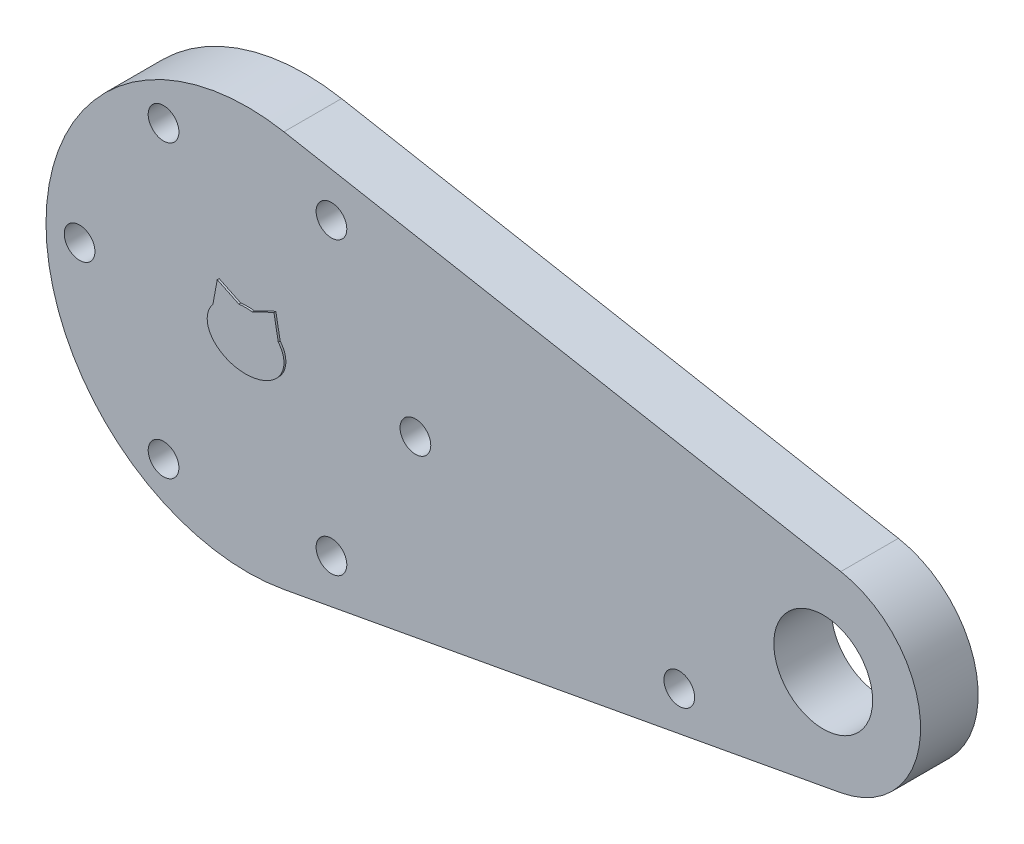
ISO-10303-21;
HEADER;
FILE_DESCRIPTION(('STEP AP214'),'2;1');
FILE_NAME('part.step','',(''),(''),'','','');
FILE_SCHEMA(('AUTOMOTIVE_DESIGN { 1 0 10303 214 1 1 1 1 }'));
ENDSEC;
DATA;
#1=APPLICATION_CONTEXT('core data for automotive mechanical design processes');
#2=APPLICATION_PROTOCOL_DEFINITION('international standard','automotive_design',2000,#1);
#3=PRODUCT_CONTEXT('',#1,'mechanical');
#4=PRODUCT('Part','Part','',(#3));
#5=PRODUCT_RELATED_PRODUCT_CATEGORY('part','',(#4));
#6=PRODUCT_DEFINITION_FORMATION('','',#4);
#7=PRODUCT_DEFINITION_CONTEXT('part definition',#1,'design');
#8=PRODUCT_DEFINITION('design','',#6,#7);
#9=PRODUCT_DEFINITION_SHAPE('','',#8);
#10=(LENGTH_UNIT() NAMED_UNIT(*) SI_UNIT(.MILLI.,.METRE.));
#11=(NAMED_UNIT(*) PLANE_ANGLE_UNIT() SI_UNIT($,.RADIAN.));
#12=(NAMED_UNIT(*) SI_UNIT($,.STERADIAN.) SOLID_ANGLE_UNIT());
#13=UNCERTAINTY_MEASURE_WITH_UNIT(LENGTH_MEASURE(1.E-05),#10,'distance_accuracy_value','');
#14=(GEOMETRIC_REPRESENTATION_CONTEXT(3) GLOBAL_UNCERTAINTY_ASSIGNED_CONTEXT((#13)) GLOBAL_UNIT_ASSIGNED_CONTEXT((#10,
#11,#12)) REPRESENTATION_CONTEXT('',''));
#15=CARTESIAN_POINT('',(0.,0.,0.));
#16=DIRECTION('',(0.,0.,1.));
#17=DIRECTION('',(1.,0.,0.));
#18=AXIS2_PLACEMENT_3D('',#15,#16,#17);
#19=CARTESIAN_POINT('',(60.,0.,6.));
#20=DIRECTION('',(0.,0.,1.));
#21=DIRECTION('',(1.,0.,0.));
#22=AXIS2_PLACEMENT_3D('',#19,#20,#21);
#23=PLANE('',#22);
#24=CARTESIAN_POINT('',(45.,-9.,6.));
#25=DIRECTION('',(0.,0.,1.));
#26=DIRECTION('',(1.,0.,0.));
#27=AXIS2_PLACEMENT_3D('',#24,#25,#26);
#28=CIRCLE('',#27,1.6);
#29=CARTESIAN_POINT('',(43.4,-9.,6.));
#30=VERTEX_POINT('',#29);
#31=EDGE_CURVE('E340',#30,#30,#28,.T.);
#32=ORIENTED_EDGE('',*,*,#31,.F.);
#33=EDGE_LOOP('',(#32));
#34=FACE_BOUND('',#33,.T.);
#35=CARTESIAN_POINT('',(-8.75000000000004,15.1554445662277,6.));
#36=DIRECTION('',(0.,0.,1.));
#37=DIRECTION('',(1.,0.,0.));
#38=AXIS2_PLACEMENT_3D('',#35,#36,#37);
#39=CIRCLE('',#38,1.6);
#40=CARTESIAN_POINT('',(-7.15000000000004,15.1554445662277,6.));
#41=VERTEX_POINT('',#40);
#42=EDGE_CURVE('E213',#41,#41,#39,.T.);
#43=ORIENTED_EDGE('',*,*,#42,.F.);
#44=EDGE_LOOP('',(#43));
#45=FACE_BOUND('',#44,.T.);
#46=CARTESIAN_POINT('',(-17.5,0.,6.));
#47=DIRECTION('',(0.,0.,1.));
#48=DIRECTION('',(1.,0.,0.));
#49=AXIS2_PLACEMENT_3D('',#46,#47,#48);
#50=CIRCLE('',#49,1.6);
#51=CARTESIAN_POINT('',(-15.9,0.,6.));
#52=VERTEX_POINT('',#51);
#53=EDGE_CURVE('E224',#52,#52,#50,.T.);
#54=ORIENTED_EDGE('',*,*,#53,.F.);
#55=EDGE_LOOP('',(#54));
#56=FACE_BOUND('',#55,.T.);
#57=CARTESIAN_POINT('',(-8.74999999999996,-15.1554445662277,6.));
#58=DIRECTION('',(0.,0.,1.));
#59=DIRECTION('',(1.,0.,0.));
#60=AXIS2_PLACEMENT_3D('',#57,#58,#59);
#61=CIRCLE('',#60,1.6);
#62=CARTESIAN_POINT('',(-7.14999999999996,-15.1554445662277,6.));
#63=VERTEX_POINT('',#62);
#64=EDGE_CURVE('E221',#63,#63,#61,.T.);
#65=ORIENTED_EDGE('',*,*,#64,.F.);
#66=EDGE_LOOP('',(#65));
#67=FACE_BOUND('',#66,.T.);
#68=CARTESIAN_POINT('',(8.75000000000004,-15.1554445662277,6.));
#69=DIRECTION('',(0.,0.,1.));
#70=DIRECTION('',(1.,0.,0.));
#71=AXIS2_PLACEMENT_3D('',#68,#69,#70);
#72=CIRCLE('',#71,1.6);
#73=CARTESIAN_POINT('',(10.35,-15.1554445662277,6.));
#74=VERTEX_POINT('',#73);
#75=EDGE_CURVE('E218',#74,#74,#72,.T.);
#76=ORIENTED_EDGE('',*,*,#75,.F.);
#77=EDGE_LOOP('',(#76));
#78=FACE_BOUND('',#77,.T.);
#79=CARTESIAN_POINT('',(17.5,0.,6.));
#80=DIRECTION('',(0.,0.,1.));
#81=DIRECTION('',(1.,0.,0.));
#82=AXIS2_PLACEMENT_3D('',#79,#80,#81);
#83=CIRCLE('',#82,1.6);
#84=CARTESIAN_POINT('',(19.1,0.,6.));
#85=VERTEX_POINT('',#84);
#86=EDGE_CURVE('E214',#85,#85,#83,.T.);
#87=ORIENTED_EDGE('',*,*,#86,.F.);
#88=EDGE_LOOP('',(#87));
#89=FACE_BOUND('',#88,.T.);
#90=CARTESIAN_POINT('',(8.74999999999996,15.1554445662277,6.));
#91=DIRECTION('',(0.,0.,1.));
#92=DIRECTION('',(1.,0.,0.));
#93=AXIS2_PLACEMENT_3D('',#90,#91,#92);
#94=CIRCLE('',#93,1.6);
#95=CARTESIAN_POINT('',(10.35,15.1554445662277,6.));
#96=VERTEX_POINT('',#95);
#97=EDGE_CURVE('E217',#96,#96,#94,.T.);
#98=ORIENTED_EDGE('',*,*,#97,.F.);
#99=EDGE_LOOP('',(#98));
#100=FACE_BOUND('',#99,.T.);
#101=CARTESIAN_POINT('',(60.,0.,6.));
#102=DIRECTION('',(0.,0.,1.));
#103=DIRECTION('',(1.,0.,0.));
#104=AXIS2_PLACEMENT_3D('',#101,#102,#103);
#105=CIRCLE('',#104,10.15);
#106=CARTESIAN_POINT('',(61.8354583333333,-9.98266460954174,6.));
#107=VERTEX_POINT('',#106);
#108=CARTESIAN_POINT('',(61.8354583333333,9.98266460954174,6.));
#109=VERTEX_POINT('',#108);
#110=EDGE_CURVE('E238',#107,#109,#105,.T.);
#111=ORIENTED_EDGE('',*,*,#110,.T.);
#112=DIRECTION('',(-0.983513754634655,0.180833333333333,0.));
#113=VECTOR('',#112,1.);
#114=CARTESIAN_POINT('',(3.7975,20.6537888473278,6.));
#115=LINE('',#114,#113);
#116=CARTESIAN_POINT('',(3.7975,20.6537888473278,6.));
#117=VERTEX_POINT('',#116);
#118=EDGE_CURVE('E94',#109,#117,#115,.T.);
#119=ORIENTED_EDGE('',*,*,#118,.T.);
#120=CARTESIAN_POINT('',(0.,0.,6.));
#121=DIRECTION('',(0.,0.,1.));
#122=DIRECTION('',(1.,0.,0.));
#123=AXIS2_PLACEMENT_3D('',#120,#121,#122);
#124=CIRCLE('',#123,21.);
#125=CARTESIAN_POINT('',(3.7975,-20.6537888473277,6.));
#126=VERTEX_POINT('',#125);
#127=EDGE_CURVE('E241',#117,#126,#124,.T.);
#128=ORIENTED_EDGE('',*,*,#127,.T.);
#129=DIRECTION('',(0.983513754634655,0.180833333333333,0.));
#130=VECTOR('',#129,1.);
#131=CARTESIAN_POINT('',(61.8354583333333,-9.98266460954174,6.));
#132=LINE('',#131,#130);
#133=EDGE_CURVE('E65',#126,#107,#132,.T.);
#134=ORIENTED_EDGE('',*,*,#133,.T.);
#135=EDGE_LOOP('',(#111,#119,#128,#134));
#136=FACE_BOUND('',#135,.T.);
#137=CARTESIAN_POINT('',(60.,0.,6.));
#138=DIRECTION('',(0.,0.,1.));
#139=DIRECTION('',(1.,0.,0.));
#140=AXIS2_PLACEMENT_3D('',#137,#138,#139);
#141=CIRCLE('',#140,5.15);
#142=CARTESIAN_POINT('',(65.15,0.,6.));
#143=VERTEX_POINT('',#142);
#144=EDGE_CURVE('E232',#143,#143,#141,.T.);
#145=ORIENTED_EDGE('',*,*,#144,.F.);
#146=EDGE_LOOP('',(#145));
#147=FACE_BOUND('',#146,.T.);
#148=DIRECTION('',(-0.180057538320754,0.983656079579581,0.));
#149=VECTOR('',#148,1.);
#150=CARTESIAN_POINT('',(2.95476962414588,4.03352655479356,6.));
#151=LINE('',#150,#149);
#152=CARTESIAN_POINT('',(3.40491346994776,1.57438635584461,6.));
#153=VERTEX_POINT('',#152);
#154=CARTESIAN_POINT('',(2.95476962414588,4.03352655479356,6.));
#155=VERTEX_POINT('',#154);
#156=EDGE_CURVE('E333',#153,#155,#151,.T.);
#157=ORIENTED_EDGE('',*,*,#156,.F.);
#158=CARTESIAN_POINT('',(0.,0.,6.));
#159=DIRECTION('',(0.,0.,1.));
#160=DIRECTION('',(1.,0.,0.));
#161=AXIS2_PLACEMENT_3D('',#158,#159,#160);
#162=ELLIPSE('',#161,4.,3.);
#163=CARTESIAN_POINT('',(-3.40491346994776,1.57438635584461,6.));
#164=VERTEX_POINT('',#163);
#165=EDGE_CURVE('E151',#164,#153,#162,.T.);
#166=ORIENTED_EDGE('',*,*,#165,.F.);
#167=DIRECTION('',(-0.180057538320754,-0.983656079579581,0.));
#168=VECTOR('',#167,1.);
#169=CARTESIAN_POINT('',(-2.95476962414588,4.03352655479356,6.));
#170=LINE('',#169,#168);
#171=CARTESIAN_POINT('',(-2.95476962414588,4.03352655479356,6.));
#172=VERTEX_POINT('',#171);
#173=EDGE_CURVE('E147',#172,#164,#170,.T.);
#174=ORIENTED_EDGE('',*,*,#173,.F.);
#175=DIRECTION('',(-0.901907849658351,0.431928501866513,0.));
#176=VECTOR('',#175,1.);
#177=CARTESIAN_POINT('',(-2.95476962414588,4.03352655479356,6.));
#178=LINE('',#177,#176);
#179=CARTESIAN_POINT('',(-0.7,2.95370530012728,6.));
#180=VERTEX_POINT('',#179);
#181=EDGE_CURVE('E345',#180,#172,#178,.T.);
#182=ORIENTED_EDGE('',*,*,#181,.F.);
#183=CARTESIAN_POINT('',(0.,0.,6.));
#184=DIRECTION('',(0.,0.,1.));
#185=DIRECTION('',(1.,0.,0.));
#186=AXIS2_PLACEMENT_3D('',#183,#184,#185);
#187=ELLIPSE('',#186,4.,3.);
#188=CARTESIAN_POINT('',(0.700000000000001,2.95370530012728,6.));
#189=VERTEX_POINT('',#188);
#190=EDGE_CURVE('E338',#189,#180,#187,.T.);
#191=ORIENTED_EDGE('',*,*,#190,.F.);
#192=DIRECTION('',(-0.901907849658351,-0.431928501866513,0.));
#193=VECTOR('',#192,1.);
#194=CARTESIAN_POINT('',(2.95476962414588,4.03352655479356,6.));
#195=LINE('',#194,#193);
#196=EDGE_CURVE('E336',#155,#189,#195,.T.);
#197=ORIENTED_EDGE('',*,*,#196,.F.);
#198=EDGE_LOOP('',(#157,#166,#174,#182,#191,#197));
#199=FACE_BOUND('',#198,.T.);
#200=ADVANCED_FACE('F39',(#34,#45,#56,#67,#78,#89,#100,#136,#147,#199),#23,.T.);
#201=CARTESIAN_POINT('',(8.74999999999996,15.1554445662277,0.));
#202=DIRECTION('',(0.,0.,1.));
#203=DIRECTION('',(1.,0.,0.));
#204=AXIS2_PLACEMENT_3D('',#201,#202,#203);
#205=CYLINDRICAL_SURFACE('',#204,1.6);
#206=ORIENTED_EDGE('',*,*,#97,.T.);
#207=EDGE_LOOP('',(#206));
#208=FACE_BOUND('',#207,.T.);
#209=CARTESIAN_POINT('',(8.74999999999996,15.1554445662277,3.));
#210=DIRECTION('',(0.,0.,-1.));
#211=DIRECTION('',(-1.,0.,0.));
#212=AXIS2_PLACEMENT_3D('',#209,#210,#211);
#213=CIRCLE('',#212,1.6);
#214=CARTESIAN_POINT('',(7.14999999999996,15.1554445662277,3.));
#215=VERTEX_POINT('',#214);
#216=EDGE_CURVE('E43',#215,#215,#213,.F.);
#217=ORIENTED_EDGE('',*,*,#216,.F.);
#218=EDGE_LOOP('',(#217));
#219=FACE_BOUND('',#218,.T.);
#220=ADVANCED_FACE('F281',(#208,#219),#205,.F.);
#221=CARTESIAN_POINT('',(17.5,0.,0.));
#222=DIRECTION('',(0.,0.,1.));
#223=DIRECTION('',(1.,0.,0.));
#224=AXIS2_PLACEMENT_3D('',#221,#222,#223);
#225=CYLINDRICAL_SURFACE('',#224,1.6);
#226=ORIENTED_EDGE('',*,*,#86,.T.);
#227=EDGE_LOOP('',(#226));
#228=FACE_BOUND('',#227,.T.);
#229=CARTESIAN_POINT('',(17.5,0.,3.));
#230=DIRECTION('',(0.,0.,-1.));
#231=DIRECTION('',(-1.,0.,0.));
#232=AXIS2_PLACEMENT_3D('',#229,#230,#231);
#233=CIRCLE('',#232,1.6);
#234=CARTESIAN_POINT('',(15.9,0.,3.));
#235=VERTEX_POINT('',#234);
#236=EDGE_CURVE('E272',#235,#235,#233,.F.);
#237=ORIENTED_EDGE('',*,*,#236,.F.);
#238=EDGE_LOOP('',(#237));
#239=FACE_BOUND('',#238,.T.);
#240=ADVANCED_FACE('F283',(#228,#239),#225,.F.);
#241=CARTESIAN_POINT('',(8.75000000000004,-15.1554445662277,0.));
#242=DIRECTION('',(0.,0.,1.));
#243=DIRECTION('',(1.,0.,0.));
#244=AXIS2_PLACEMENT_3D('',#241,#242,#243);
#245=CYLINDRICAL_SURFACE('',#244,1.6);
#246=ORIENTED_EDGE('',*,*,#75,.T.);
#247=EDGE_LOOP('',(#246));
#248=FACE_BOUND('',#247,.T.);
#249=CARTESIAN_POINT('',(8.75000000000004,-15.1554445662277,3.));
#250=DIRECTION('',(0.,0.,-1.));
#251=DIRECTION('',(-1.,0.,0.));
#252=AXIS2_PLACEMENT_3D('',#249,#250,#251);
#253=CIRCLE('',#252,1.6);
#254=CARTESIAN_POINT('',(7.15000000000004,-15.1554445662277,3.));
#255=VERTEX_POINT('',#254);
#256=EDGE_CURVE('E270',#255,#255,#253,.F.);
#257=ORIENTED_EDGE('',*,*,#256,.F.);
#258=EDGE_LOOP('',(#257));
#259=FACE_BOUND('',#258,.T.);
#260=ADVANCED_FACE('F290',(#248,#259),#245,.F.);
#261=CARTESIAN_POINT('',(-8.74999999999996,-15.1554445662277,0.));
#262=DIRECTION('',(0.,0.,1.));
#263=DIRECTION('',(1.,0.,0.));
#264=AXIS2_PLACEMENT_3D('',#261,#262,#263);
#265=CYLINDRICAL_SURFACE('',#264,1.6);
#266=ORIENTED_EDGE('',*,*,#64,.T.);
#267=EDGE_LOOP('',(#266));
#268=FACE_BOUND('',#267,.T.);
#269=CARTESIAN_POINT('',(-8.74999999999996,-15.1554445662277,3.));
#270=DIRECTION('',(0.,0.,-1.));
#271=DIRECTION('',(-1.,0.,0.));
#272=AXIS2_PLACEMENT_3D('',#269,#270,#271);
#273=CIRCLE('',#272,1.6);
#274=CARTESIAN_POINT('',(-10.35,-15.1554445662277,3.));
#275=VERTEX_POINT('',#274);
#276=EDGE_CURVE('E267',#275,#275,#273,.F.);
#277=ORIENTED_EDGE('',*,*,#276,.F.);
#278=EDGE_LOOP('',(#277));
#279=FACE_BOUND('',#278,.T.);
#280=ADVANCED_FACE('F425',(#268,#279),#265,.F.);
#281=CARTESIAN_POINT('',(-17.5,0.,0.));
#282=DIRECTION('',(0.,0.,1.));
#283=DIRECTION('',(1.,0.,0.));
#284=AXIS2_PLACEMENT_3D('',#281,#282,#283);
#285=CYLINDRICAL_SURFACE('',#284,1.6);
#286=ORIENTED_EDGE('',*,*,#53,.T.);
#287=EDGE_LOOP('',(#286));
#288=FACE_BOUND('',#287,.T.);
#289=CARTESIAN_POINT('',(-17.5,0.,3.));
#290=DIRECTION('',(0.,0.,-1.));
#291=DIRECTION('',(-1.,0.,0.));
#292=AXIS2_PLACEMENT_3D('',#289,#290,#291);
#293=CIRCLE('',#292,1.6);
#294=CARTESIAN_POINT('',(-19.1,0.,3.));
#295=VERTEX_POINT('',#294);
#296=EDGE_CURVE('E264',#295,#295,#293,.F.);
#297=ORIENTED_EDGE('',*,*,#296,.F.);
#298=EDGE_LOOP('',(#297));
#299=FACE_BOUND('',#298,.T.);
#300=ADVANCED_FACE('F428',(#288,#299),#285,.F.);
#301=CARTESIAN_POINT('',(-8.75000000000004,15.1554445662277,0.));
#302=DIRECTION('',(0.,0.,1.));
#303=DIRECTION('',(1.,0.,0.));
#304=AXIS2_PLACEMENT_3D('',#301,#302,#303);
#305=CYLINDRICAL_SURFACE('',#304,1.6);
#306=ORIENTED_EDGE('',*,*,#42,.T.);
#307=EDGE_LOOP('',(#306));
#308=FACE_BOUND('',#307,.T.);
#309=CARTESIAN_POINT('',(-8.75000000000004,15.1554445662277,3.));
#310=DIRECTION('',(0.,0.,-1.));
#311=DIRECTION('',(-1.,0.,0.));
#312=AXIS2_PLACEMENT_3D('',#309,#310,#311);
#313=CIRCLE('',#312,1.6);
#314=CARTESIAN_POINT('',(-10.35,15.1554445662277,3.));
#315=VERTEX_POINT('',#314);
#316=EDGE_CURVE('E192',#315,#315,#313,.F.);
#317=ORIENTED_EDGE('',*,*,#316,.F.);
#318=EDGE_LOOP('',(#317));
#319=FACE_BOUND('',#318,.T.);
#320=ADVANCED_FACE('F298',(#308,#319),#305,.F.);
#321=CARTESIAN_POINT('',(60.,0.,0.));
#322=DIRECTION('',(0.,0.,1.));
#323=DIRECTION('',(1.,0.,0.));
#324=AXIS2_PLACEMENT_3D('',#321,#322,#323);
#325=PLANE('',#324);
#326=CARTESIAN_POINT('',(45.,-9.,0.));
#327=DIRECTION('',(0.,0.,-1.));
#328=DIRECTION('',(-1.,0.,0.));
#329=AXIS2_PLACEMENT_3D('',#326,#327,#328);
#330=CIRCLE('',#329,1.6);
#331=CARTESIAN_POINT('',(43.4,-9.,0.));
#332=VERTEX_POINT('',#331);
#333=EDGE_CURVE('E389',#332,#332,#330,.T.);
#334=ORIENTED_EDGE('',*,*,#333,.F.);
#335=EDGE_LOOP('',(#334));
#336=FACE_BOUND('',#335,.T.);
#337=CARTESIAN_POINT('',(8.74999999999996,15.1554445662277,0.));
#338=DIRECTION('',(0.,0.,-1.));
#339=DIRECTION('',(-1.,0.,0.));
#340=AXIS2_PLACEMENT_3D('',#337,#338,#339);
#341=CIRCLE('',#340,2.85);
#342=CARTESIAN_POINT('',(5.89999999999996,15.1554445662277,0.));
#343=VERTEX_POINT('',#342);
#344=EDGE_CURVE('E156',#343,#343,#341,.T.);
#345=ORIENTED_EDGE('',*,*,#344,.F.);
#346=EDGE_LOOP('',(#345));
#347=FACE_BOUND('',#346,.T.);
#348=CARTESIAN_POINT('',(17.5,0.,0.));
#349=DIRECTION('',(0.,0.,-1.));
#350=DIRECTION('',(-1.,0.,0.));
#351=AXIS2_PLACEMENT_3D('',#348,#349,#350);
#352=CIRCLE('',#351,2.85);
#353=CARTESIAN_POINT('',(14.65,0.,0.));
#354=VERTEX_POINT('',#353);
#355=EDGE_CURVE('E181',#354,#354,#352,.T.);
#356=ORIENTED_EDGE('',*,*,#355,.F.);
#357=EDGE_LOOP('',(#356));
#358=FACE_BOUND('',#357,.T.);
#359=CARTESIAN_POINT('',(8.75000000000004,-15.1554445662277,0.));
#360=DIRECTION('',(0.,0.,-1.));
#361=DIRECTION('',(-1.,0.,0.));
#362=AXIS2_PLACEMENT_3D('',#359,#360,#361);
#363=CIRCLE('',#362,2.85);
#364=CARTESIAN_POINT('',(5.90000000000003,-15.1554445662277,0.));
#365=VERTEX_POINT('',#364);
#366=EDGE_CURVE('E175',#365,#365,#363,.T.);
#367=ORIENTED_EDGE('',*,*,#366,.F.);
#368=EDGE_LOOP('',(#367));
#369=FACE_BOUND('',#368,.T.);
#370=CARTESIAN_POINT('',(-8.74999999999997,-15.1554445662277,0.));
#371=DIRECTION('',(0.,0.,-1.));
#372=DIRECTION('',(-1.,0.,0.));
#373=AXIS2_PLACEMENT_3D('',#370,#371,#372);
#374=CIRCLE('',#373,2.85);
#375=CARTESIAN_POINT('',(-11.6,-15.1554445662277,0.));
#376=VERTEX_POINT('',#375);
#377=EDGE_CURVE('E169',#376,#376,#374,.T.);
#378=ORIENTED_EDGE('',*,*,#377,.F.);
#379=EDGE_LOOP('',(#378));
#380=FACE_BOUND('',#379,.T.);
#381=CARTESIAN_POINT('',(-17.5,0.,0.));
#382=DIRECTION('',(0.,0.,-1.));
#383=DIRECTION('',(-1.,0.,0.));
#384=AXIS2_PLACEMENT_3D('',#381,#382,#383);
#385=CIRCLE('',#384,2.85);
#386=CARTESIAN_POINT('',(-20.35,0.,0.));
#387=VERTEX_POINT('',#386);
#388=EDGE_CURVE('E162',#387,#387,#385,.T.);
#389=ORIENTED_EDGE('',*,*,#388,.F.);
#390=EDGE_LOOP('',(#389));
#391=FACE_BOUND('',#390,.T.);
#392=CARTESIAN_POINT('',(-8.75000000000004,15.1554445662277,0.));
#393=DIRECTION('',(0.,0.,-1.));
#394=DIRECTION('',(-1.,0.,0.));
#395=AXIS2_PLACEMENT_3D('',#392,#393,#394);
#396=CIRCLE('',#395,2.85);
#397=CARTESIAN_POINT('',(-11.6,15.1554445662277,0.));
#398=VERTEX_POINT('',#397);
#399=EDGE_CURVE('E165',#398,#398,#396,.T.);
#400=ORIENTED_EDGE('',*,*,#399,.F.);
#401=EDGE_LOOP('',(#400));
#402=FACE_BOUND('',#401,.T.);
#403=CARTESIAN_POINT('',(0.,0.,0.));
#404=DIRECTION('',(0.,0.,1.));
#405=DIRECTION('',(1.,0.,0.));
#406=AXIS2_PLACEMENT_3D('',#403,#404,#405);
#407=CIRCLE('',#406,13.5);
#408=CARTESIAN_POINT('',(13.5,0.,0.));
#409=VERTEX_POINT('',#408);
#410=EDGE_CURVE('E48',#409,#409,#407,.F.);
#411=ORIENTED_EDGE('',*,*,#410,.F.);
#412=EDGE_LOOP('',(#411));
#413=FACE_BOUND('',#412,.T.);
#414=CARTESIAN_POINT('',(60.,0.,0.));
#415=DIRECTION('',(0.,0.,1.));
#416=DIRECTION('',(1.,0.,0.));
#417=AXIS2_PLACEMENT_3D('',#414,#415,#416);
#418=CIRCLE('',#417,10.15);
#419=CARTESIAN_POINT('',(61.8354583333333,-9.98266460954174,0.));
#420=VERTEX_POINT('',#419);
#421=CARTESIAN_POINT('',(61.8354583333333,9.98266460954174,0.));
#422=VERTEX_POINT('',#421);
#423=EDGE_CURVE('E235',#420,#422,#418,.T.);
#424=ORIENTED_EDGE('',*,*,#423,.F.);
#425=DIRECTION('',(0.983513754634655,0.180833333333333,0.));
#426=VECTOR('',#425,1.);
#427=CARTESIAN_POINT('',(61.8354583333333,-9.98266460954174,0.));
#428=LINE('',#427,#426);
#429=CARTESIAN_POINT('',(3.7975,-20.6537888473277,0.));
#430=VERTEX_POINT('',#429);
#431=EDGE_CURVE('E86',#430,#420,#428,.T.);
#432=ORIENTED_EDGE('',*,*,#431,.F.);
#433=CARTESIAN_POINT('',(0.,0.,0.));
#434=DIRECTION('',(0.,0.,1.));
#435=DIRECTION('',(1.,0.,0.));
#436=AXIS2_PLACEMENT_3D('',#433,#434,#435);
#437=CIRCLE('',#436,21.);
#438=CARTESIAN_POINT('',(3.7975,20.6537888473278,0.));
#439=VERTEX_POINT('',#438);
#440=EDGE_CURVE('E249',#439,#430,#437,.T.);
#441=ORIENTED_EDGE('',*,*,#440,.F.);
#442=DIRECTION('',(-0.983513754634655,0.180833333333333,0.));
#443=VECTOR('',#442,1.);
#444=CARTESIAN_POINT('',(3.7975,20.6537888473278,0.));
#445=LINE('',#444,#443);
#446=EDGE_CURVE('E247',#422,#439,#445,.T.);
#447=ORIENTED_EDGE('',*,*,#446,.F.);
#448=EDGE_LOOP('',(#424,#432,#441,#447));
#449=FACE_BOUND('',#448,.T.);
#450=CARTESIAN_POINT('',(60.,0.,0.));
#451=DIRECTION('',(0.,0.,1.));
#452=DIRECTION('',(1.,0.,0.));
#453=AXIS2_PLACEMENT_3D('',#450,#451,#452);
#454=CIRCLE('',#453,5.15);
#455=CARTESIAN_POINT('',(65.15,0.,0.));
#456=VERTEX_POINT('',#455);
#457=EDGE_CURVE('E231',#456,#456,#454,.T.);
#458=ORIENTED_EDGE('',*,*,#457,.T.);
#459=EDGE_LOOP('',(#458));
#460=FACE_BOUND('',#459,.T.);
#461=ADVANCED_FACE('F306',(#336,#347,#358,#369,#380,#391,#402,#413,#449,#460),#325,.F.);
#462=CARTESIAN_POINT('',(60.,0.,6.));
#463=DIRECTION('',(0.,0.,-1.));
#464=DIRECTION('',(-1.,0.,0.));
#465=AXIS2_PLACEMENT_3D('',#462,#463,#464);
#466=CYLINDRICAL_SURFACE('',#465,10.15);
#467=ORIENTED_EDGE('',*,*,#423,.T.);
#468=DIRECTION('',(0.,0.,-1.));
#469=VECTOR('',#468,1.);
#470=CARTESIAN_POINT('',(61.8354583333333,9.98266460954174,6.));
#471=LINE('',#470,#469);
#472=EDGE_CURVE('E258',#109,#422,#471,.T.);
#473=ORIENTED_EDGE('',*,*,#472,.F.);
#474=ORIENTED_EDGE('',*,*,#110,.F.);
#475=DIRECTION('',(0.,0.,-1.));
#476=VECTOR('',#475,1.);
#477=CARTESIAN_POINT('',(61.8354583333333,-9.98266460954174,6.));
#478=LINE('',#477,#476);
#479=EDGE_CURVE('E244',#107,#420,#478,.T.);
#480=ORIENTED_EDGE('',*,*,#479,.T.);
#481=EDGE_LOOP('',(#467,#473,#474,#480));
#482=FACE_BOUND('',#481,.T.);
#483=ADVANCED_FACE('F41',(#482),#466,.T.);
#484=CARTESIAN_POINT('',(3.7975,20.6537888473278,6.));
#485=DIRECTION('',(-0.180833333333333,-0.983513754634655,0.));
#486=DIRECTION('',(0.983513754634655,-0.180833333333333,0.));
#487=AXIS2_PLACEMENT_3D('',#484,#485,#486);
#488=PLANE('',#487);
#489=ORIENTED_EDGE('',*,*,#446,.T.);
#490=DIRECTION('',(0.,0.,-1.));
#491=VECTOR('',#490,1.);
#492=CARTESIAN_POINT('',(3.7975,20.6537888473278,6.));
#493=LINE('',#492,#491);
#494=EDGE_CURVE('E255',#117,#439,#493,.T.);
#495=ORIENTED_EDGE('',*,*,#494,.F.);
#496=ORIENTED_EDGE('',*,*,#118,.F.);
#497=ORIENTED_EDGE('',*,*,#472,.T.);
#498=EDGE_LOOP('',(#489,#495,#496,#497));
#499=FACE_BOUND('',#498,.T.);
#500=ADVANCED_FACE('F314',(#499),#488,.F.);
#501=CARTESIAN_POINT('',(0.,0.,6.));
#502=DIRECTION('',(0.,0.,-1.));
#503=DIRECTION('',(-1.,0.,0.));
#504=AXIS2_PLACEMENT_3D('',#501,#502,#503);
#505=CYLINDRICAL_SURFACE('',#504,21.);
#506=ORIENTED_EDGE('',*,*,#440,.T.);
#507=DIRECTION('',(0.,0.,-1.));
#508=VECTOR('',#507,1.);
#509=CARTESIAN_POINT('',(3.7975,-20.6537888473277,6.));
#510=LINE('',#509,#508);
#511=EDGE_CURVE('E253',#126,#430,#510,.T.);
#512=ORIENTED_EDGE('',*,*,#511,.F.);
#513=ORIENTED_EDGE('',*,*,#127,.F.);
#514=ORIENTED_EDGE('',*,*,#494,.T.);
#515=EDGE_LOOP('',(#506,#512,#513,#514));
#516=FACE_BOUND('',#515,.T.);
#517=ADVANCED_FACE('F312',(#516),#505,.T.);
#518=CARTESIAN_POINT('',(61.8354583333333,-9.98266460954174,6.));
#519=DIRECTION('',(-0.180833333333333,0.983513754634655,0.));
#520=DIRECTION('',(-0.983513754634655,-0.180833333333333,0.));
#521=AXIS2_PLACEMENT_3D('',#518,#519,#520);
#522=PLANE('',#521);
#523=ORIENTED_EDGE('',*,*,#431,.T.);
#524=ORIENTED_EDGE('',*,*,#479,.F.);
#525=ORIENTED_EDGE('',*,*,#133,.F.);
#526=ORIENTED_EDGE('',*,*,#511,.T.);
#527=EDGE_LOOP('',(#523,#524,#525,#526));
#528=FACE_BOUND('',#527,.T.);
#529=ADVANCED_FACE('F303',(#528),#522,.F.);
#530=CARTESIAN_POINT('',(60.,0.,6.));
#531=DIRECTION('',(0.,0.,-1.));
#532=DIRECTION('',(-1.,0.,0.));
#533=AXIS2_PLACEMENT_3D('',#530,#531,#532);
#534=CYLINDRICAL_SURFACE('',#533,5.15);
#535=ORIENTED_EDGE('',*,*,#144,.T.);
#536=EDGE_LOOP('',(#535));
#537=FACE_BOUND('',#536,.T.);
#538=ORIENTED_EDGE('',*,*,#457,.F.);
#539=EDGE_LOOP('',(#538));
#540=FACE_BOUND('',#539,.T.);
#541=ADVANCED_FACE('F300',(#537,#540),#534,.F.);
#542=CARTESIAN_POINT('',(0.,0.,-0.5));
#543=DIRECTION('',(0.,0.,1.));
#544=DIRECTION('',(1.,0.,0.));
#545=AXIS2_PLACEMENT_3D('',#542,#543,#544);
#546=CYLINDRICAL_SURFACE('',#545,13.5);
#547=CARTESIAN_POINT('',(0.,0.,-0.5));
#548=DIRECTION('',(0.,0.,-1.));
#549=DIRECTION('',(-1.,0.,0.));
#550=AXIS2_PLACEMENT_3D('',#547,#548,#549);
#551=CIRCLE('',#550,13.5);
#552=CARTESIAN_POINT('',(-13.5,0.,-0.5));
#553=VERTEX_POINT('',#552);
#554=EDGE_CURVE('E208',#553,#553,#551,.T.);
#555=ORIENTED_EDGE('',*,*,#554,.F.);
#556=EDGE_LOOP('',(#555));
#557=FACE_BOUND('',#556,.T.);
#558=ORIENTED_EDGE('',*,*,#410,.T.);
#559=EDGE_LOOP('',(#558));
#560=FACE_BOUND('',#559,.T.);
#561=ADVANCED_FACE('F302',(#557,#560),#546,.T.);
#562=CARTESIAN_POINT('',(0.,0.,-0.5));
#563=DIRECTION('',(0.,0.,-1.));
#564=DIRECTION('',(-1.,0.,0.));
#565=AXIS2_PLACEMENT_3D('',#562,#563,#564);
#566=PLANE('',#565);
#567=CARTESIAN_POINT('',(0.,0.,-0.5));
#568=DIRECTION('',(0.,0.,-1.));
#569=DIRECTION('',(-1.,0.,0.));
#570=AXIS2_PLACEMENT_3D('',#567,#568,#569);
#571=CIRCLE('',#570,12.35);
#572=CARTESIAN_POINT('',(-12.35,0.,-0.5));
#573=VERTEX_POINT('',#572);
#574=EDGE_CURVE('E204',#573,#573,#571,.T.);
#575=ORIENTED_EDGE('',*,*,#574,.F.);
#576=EDGE_LOOP('',(#575));
#577=FACE_BOUND('',#576,.T.);
#578=ORIENTED_EDGE('',*,*,#554,.T.);
#579=EDGE_LOOP('',(#578));
#580=FACE_BOUND('',#579,.T.);
#581=ADVANCED_FACE('F410',(#577,#580),#566,.T.);
#582=CARTESIAN_POINT('',(0.,0.,-4.5));
#583=DIRECTION('',(0.,0.,-1.));
#584=DIRECTION('',(-1.,0.,0.));
#585=AXIS2_PLACEMENT_3D('',#582,#583,#584);
#586=PLANE('',#585);
#587=CARTESIAN_POINT('',(0.,0.,-4.5));
#588=DIRECTION('',(0.,0.,-1.));
#589=DIRECTION('',(-1.,0.,0.));
#590=AXIS2_PLACEMENT_3D('',#587,#588,#589);
#591=CIRCLE('',#590,12.35);
#592=CARTESIAN_POINT('',(-12.35,0.,-4.5));
#593=VERTEX_POINT('',#592);
#594=EDGE_CURVE('E205',#593,#593,#591,.T.);
#595=ORIENTED_EDGE('',*,*,#594,.T.);
#596=EDGE_LOOP('',(#595));
#597=FACE_BOUND('',#596,.T.);
#598=CARTESIAN_POINT('',(0.,0.,-4.5));
#599=DIRECTION('',(0.,0.,-1.));
#600=DIRECTION('',(-1.,0.,0.));
#601=AXIS2_PLACEMENT_3D('',#598,#599,#600);
#602=CIRCLE('',#601,7.65);
#603=CARTESIAN_POINT('',(-7.65,0.,-4.5));
#604=VERTEX_POINT('',#603);
#605=EDGE_CURVE('E198',#604,#604,#602,.T.);
#606=ORIENTED_EDGE('',*,*,#605,.F.);
#607=EDGE_LOOP('',(#606));
#608=FACE_BOUND('',#607,.T.);
#609=ADVANCED_FACE('F416',(#597,#608),#586,.T.);
#610=CARTESIAN_POINT('',(0.,0.,-4.5));
#611=DIRECTION('',(0.,0.,1.));
#612=DIRECTION('',(1.,0.,0.));
#613=AXIS2_PLACEMENT_3D('',#610,#611,#612);
#614=CYLINDRICAL_SURFACE('',#613,12.35);
#615=ORIENTED_EDGE('',*,*,#594,.F.);
#616=EDGE_LOOP('',(#615));
#617=FACE_BOUND('',#616,.T.);
#618=ORIENTED_EDGE('',*,*,#574,.T.);
#619=EDGE_LOOP('',(#618));
#620=FACE_BOUND('',#619,.T.);
#621=ADVANCED_FACE('F496',(#617,#620),#614,.T.);
#622=CARTESIAN_POINT('',(0.,0.,-4.5));
#623=DIRECTION('',(0.,0.,1.));
#624=DIRECTION('',(1.,0.,0.));
#625=AXIS2_PLACEMENT_3D('',#622,#623,#624);
#626=CYLINDRICAL_SURFACE('',#625,7.65);
#627=ORIENTED_EDGE('',*,*,#605,.T.);
#628=EDGE_LOOP('',(#627));
#629=FACE_BOUND('',#628,.T.);
#630=CARTESIAN_POINT('',(0.,0.,-0.5));
#631=DIRECTION('',(0.,0.,-1.));
#632=DIRECTION('',(-1.,0.,0.));
#633=AXIS2_PLACEMENT_3D('',#630,#631,#632);
#634=CIRCLE('',#633,7.65);
#635=CARTESIAN_POINT('',(-7.65,0.,-0.5));
#636=VERTEX_POINT('',#635);
#637=EDGE_CURVE('E11',#636,#636,#634,.F.);
#638=ORIENTED_EDGE('',*,*,#637,.T.);
#639=EDGE_LOOP('',(#638));
#640=FACE_BOUND('',#639,.T.);
#641=ADVANCED_FACE('F493',(#629,#640),#626,.F.);
#642=CARTESIAN_POINT('',(0.,0.,-0.5));
#643=DIRECTION('',(0.,0.,-1.));
#644=DIRECTION('',(-1.,0.,0.));
#645=AXIS2_PLACEMENT_3D('',#642,#643,#644);
#646=CIRCLE('',#645,3.);
#647=CARTESIAN_POINT('',(-3.,0.,-0.5));
#648=VERTEX_POINT('',#647);
#649=EDGE_CURVE('E199',#648,#648,#646,.T.);
#650=ORIENTED_EDGE('',*,*,#649,.F.);
#651=EDGE_LOOP('',(#650));
#652=FACE_BOUND('',#651,.T.);
#653=ORIENTED_EDGE('',*,*,#637,.F.);
#654=EDGE_LOOP('',(#653));
#655=FACE_BOUND('',#654,.T.);
#656=ADVANCED_FACE('F419',(#652,#655),#566,.T.);
#657=CARTESIAN_POINT('',(0.,0.,2.5));
#658=DIRECTION('',(0.,0.,-1.));
#659=DIRECTION('',(-1.,0.,0.));
#660=AXIS2_PLACEMENT_3D('',#657,#658,#659);
#661=CYLINDRICAL_SURFACE('',#660,3.);
#662=CARTESIAN_POINT('',(0.,0.,2.5));
#663=DIRECTION('',(0.,0.,-1.));
#664=DIRECTION('',(-1.,0.,0.));
#665=AXIS2_PLACEMENT_3D('',#662,#663,#664);
#666=CIRCLE('',#665,3.);
#667=CARTESIAN_POINT('',(-3.,0.,2.5));
#668=VERTEX_POINT('',#667);
#669=EDGE_CURVE('E195',#668,#668,#666,.T.);
#670=ORIENTED_EDGE('',*,*,#669,.F.);
#671=EDGE_LOOP('',(#670));
#672=FACE_BOUND('',#671,.T.);
#673=ORIENTED_EDGE('',*,*,#649,.T.);
#674=EDGE_LOOP('',(#673));
#675=FACE_BOUND('',#674,.T.);
#676=ADVANCED_FACE('F488',(#672,#675),#661,.F.);
#677=CARTESIAN_POINT('',(0.,0.,2.5));
#678=DIRECTION('',(0.,0.,-1.));
#679=DIRECTION('',(-1.,0.,0.));
#680=AXIS2_PLACEMENT_3D('',#677,#678,#679);
#681=PLANE('',#680);
#682=ORIENTED_EDGE('',*,*,#669,.T.);
#683=EDGE_LOOP('',(#682));
#684=FACE_BOUND('',#683,.T.);
#685=ADVANCED_FACE('F484',(#684),#681,.T.);
#686=CARTESIAN_POINT('',(-8.75000000000004,15.1554445662277,3.));
#687=DIRECTION('',(0.,0.,-1.));
#688=DIRECTION('',(-1.,0.,0.));
#689=AXIS2_PLACEMENT_3D('',#686,#687,#688);
#690=PLANE('',#689);
#691=CARTESIAN_POINT('',(-8.75000000000004,15.1554445662277,3.));
#692=DIRECTION('',(0.,0.,-1.));
#693=DIRECTION('',(-1.,0.,0.));
#694=AXIS2_PLACEMENT_3D('',#691,#692,#693);
#695=CIRCLE('',#694,2.85);
#696=CARTESIAN_POINT('',(-11.6,15.1554445662277,3.));
#697=VERTEX_POINT('',#696);
#698=EDGE_CURVE('E189',#697,#697,#695,.T.);
#699=ORIENTED_EDGE('',*,*,#698,.T.);
#700=EDGE_LOOP('',(#699));
#701=FACE_BOUND('',#700,.T.);
#702=ORIENTED_EDGE('',*,*,#316,.T.);
#703=EDGE_LOOP('',(#702));
#704=FACE_BOUND('',#703,.T.);
#705=ADVANCED_FACE('F450',(#701,#704),#690,.T.);
#706=CARTESIAN_POINT('',(-8.75000000000004,15.1554445662277,3.));
#707=DIRECTION('',(0.,0.,-1.));
#708=DIRECTION('',(-1.,0.,0.));
#709=AXIS2_PLACEMENT_3D('',#706,#707,#708);
#710=CYLINDRICAL_SURFACE('',#709,2.85);
#711=ORIENTED_EDGE('',*,*,#698,.F.);
#712=EDGE_LOOP('',(#711));
#713=FACE_BOUND('',#712,.T.);
#714=ORIENTED_EDGE('',*,*,#399,.T.);
#715=EDGE_LOOP('',(#714));
#716=FACE_BOUND('',#715,.T.);
#717=ADVANCED_FACE('F442',(#713,#716),#710,.F.);
#718=CARTESIAN_POINT('',(-17.5,0.,3.));
#719=DIRECTION('',(0.,0.,-1.));
#720=DIRECTION('',(-1.,0.,0.));
#721=AXIS2_PLACEMENT_3D('',#718,#719,#720);
#722=PLANE('',#721);
#723=CARTESIAN_POINT('',(-17.5,0.,3.));
#724=DIRECTION('',(0.,0.,-1.));
#725=DIRECTION('',(-1.,0.,0.));
#726=AXIS2_PLACEMENT_3D('',#723,#724,#725);
#727=CIRCLE('',#726,2.85);
#728=CARTESIAN_POINT('',(-20.35,0.,3.));
#729=VERTEX_POINT('',#728);
#730=EDGE_CURVE('E166',#729,#729,#727,.T.);
#731=ORIENTED_EDGE('',*,*,#730,.T.);
#732=EDGE_LOOP('',(#731));
#733=FACE_BOUND('',#732,.T.);
#734=ORIENTED_EDGE('',*,*,#296,.T.);
#735=EDGE_LOOP('',(#734));
#736=FACE_BOUND('',#735,.T.);
#737=ADVANCED_FACE('F440',(#733,#736),#722,.T.);
#738=CARTESIAN_POINT('',(-17.5,0.,3.));
#739=DIRECTION('',(0.,0.,-1.));
#740=DIRECTION('',(-1.,0.,0.));
#741=AXIS2_PLACEMENT_3D('',#738,#739,#740);
#742=CYLINDRICAL_SURFACE('',#741,2.85);
#743=ORIENTED_EDGE('',*,*,#730,.F.);
#744=EDGE_LOOP('',(#743));
#745=FACE_BOUND('',#744,.T.);
#746=ORIENTED_EDGE('',*,*,#388,.T.);
#747=EDGE_LOOP('',(#746));
#748=FACE_BOUND('',#747,.T.);
#749=ADVANCED_FACE('F383',(#745,#748),#742,.F.);
#750=CARTESIAN_POINT('',(-8.74999999999997,-15.1554445662277,3.));
#751=DIRECTION('',(0.,0.,-1.));
#752=DIRECTION('',(-1.,0.,0.));
#753=AXIS2_PLACEMENT_3D('',#750,#751,#752);
#754=PLANE('',#753);
#755=CARTESIAN_POINT('',(-8.74999999999997,-15.1554445662277,3.));
#756=DIRECTION('',(0.,0.,-1.));
#757=DIRECTION('',(-1.,0.,0.));
#758=AXIS2_PLACEMENT_3D('',#755,#756,#757);
#759=CIRCLE('',#758,2.85);
#760=CARTESIAN_POINT('',(-11.6,-15.1554445662277,3.));
#761=VERTEX_POINT('',#760);
#762=EDGE_CURVE('E172',#761,#761,#759,.T.);
#763=ORIENTED_EDGE('',*,*,#762,.T.);
#764=EDGE_LOOP('',(#763));
#765=FACE_BOUND('',#764,.T.);
#766=ORIENTED_EDGE('',*,*,#276,.T.);
#767=EDGE_LOOP('',(#766));
#768=FACE_BOUND('',#767,.T.);
#769=ADVANCED_FACE('F448',(#765,#768),#754,.T.);
#770=CARTESIAN_POINT('',(-8.74999999999997,-15.1554445662277,3.));
#771=DIRECTION('',(0.,0.,-1.));
#772=DIRECTION('',(-1.,0.,0.));
#773=AXIS2_PLACEMENT_3D('',#770,#771,#772);
#774=CYLINDRICAL_SURFACE('',#773,2.85);
#775=ORIENTED_EDGE('',*,*,#762,.F.);
#776=EDGE_LOOP('',(#775));
#777=FACE_BOUND('',#776,.T.);
#778=ORIENTED_EDGE('',*,*,#377,.T.);
#779=EDGE_LOOP('',(#778));
#780=FACE_BOUND('',#779,.T.);
#781=ADVANCED_FACE('F454',(#777,#780),#774,.F.);
#782=CARTESIAN_POINT('',(8.75000000000004,-15.1554445662277,3.));
#783=DIRECTION('',(0.,0.,-1.));
#784=DIRECTION('',(-1.,0.,0.));
#785=AXIS2_PLACEMENT_3D('',#782,#783,#784);
#786=PLANE('',#785);
#787=CARTESIAN_POINT('',(8.75000000000004,-15.1554445662277,3.));
#788=DIRECTION('',(0.,0.,-1.));
#789=DIRECTION('',(-1.,0.,0.));
#790=AXIS2_PLACEMENT_3D('',#787,#788,#789);
#791=CIRCLE('',#790,2.85);
#792=CARTESIAN_POINT('',(5.90000000000003,-15.1554445662277,3.));
#793=VERTEX_POINT('',#792);
#794=EDGE_CURVE('E178',#793,#793,#791,.T.);
#795=ORIENTED_EDGE('',*,*,#794,.T.);
#796=EDGE_LOOP('',(#795));
#797=FACE_BOUND('',#796,.T.);
#798=ORIENTED_EDGE('',*,*,#256,.T.);
#799=EDGE_LOOP('',(#798));
#800=FACE_BOUND('',#799,.T.);
#801=ADVANCED_FACE('F457',(#797,#800),#786,.T.);
#802=CARTESIAN_POINT('',(8.75000000000004,-15.1554445662277,3.));
#803=DIRECTION('',(0.,0.,-1.));
#804=DIRECTION('',(-1.,0.,0.));
#805=AXIS2_PLACEMENT_3D('',#802,#803,#804);
#806=CYLINDRICAL_SURFACE('',#805,2.85);
#807=ORIENTED_EDGE('',*,*,#794,.F.);
#808=EDGE_LOOP('',(#807));
#809=FACE_BOUND('',#808,.T.);
#810=ORIENTED_EDGE('',*,*,#366,.T.);
#811=EDGE_LOOP('',(#810));
#812=FACE_BOUND('',#811,.T.);
#813=ADVANCED_FACE('F462',(#809,#812),#806,.F.);
#814=CARTESIAN_POINT('',(17.5,0.,3.));
#815=DIRECTION('',(0.,0.,-1.));
#816=DIRECTION('',(-1.,0.,0.));
#817=AXIS2_PLACEMENT_3D('',#814,#815,#816);
#818=PLANE('',#817);
#819=CARTESIAN_POINT('',(17.5,0.,3.));
#820=DIRECTION('',(0.,0.,-1.));
#821=DIRECTION('',(-1.,0.,0.));
#822=AXIS2_PLACEMENT_3D('',#819,#820,#821);
#823=CIRCLE('',#822,2.85);
#824=CARTESIAN_POINT('',(14.65,0.,3.));
#825=VERTEX_POINT('',#824);
#826=EDGE_CURVE('E184',#825,#825,#823,.T.);
#827=ORIENTED_EDGE('',*,*,#826,.T.);
#828=EDGE_LOOP('',(#827));
#829=FACE_BOUND('',#828,.T.);
#830=ORIENTED_EDGE('',*,*,#236,.T.);
#831=EDGE_LOOP('',(#830));
#832=FACE_BOUND('',#831,.T.);
#833=ADVANCED_FACE('F465',(#829,#832),#818,.T.);
#834=CARTESIAN_POINT('',(17.5,0.,3.));
#835=DIRECTION('',(0.,0.,-1.));
#836=DIRECTION('',(-1.,0.,0.));
#837=AXIS2_PLACEMENT_3D('',#834,#835,#836);
#838=CYLINDRICAL_SURFACE('',#837,2.85);
#839=ORIENTED_EDGE('',*,*,#826,.F.);
#840=EDGE_LOOP('',(#839));
#841=FACE_BOUND('',#840,.T.);
#842=ORIENTED_EDGE('',*,*,#355,.T.);
#843=EDGE_LOOP('',(#842));
#844=FACE_BOUND('',#843,.T.);
#845=ADVANCED_FACE('F470',(#841,#844),#838,.F.);
#846=CARTESIAN_POINT('',(8.74999999999996,15.1554445662277,3.));
#847=DIRECTION('',(0.,0.,-1.));
#848=DIRECTION('',(-1.,0.,0.));
#849=AXIS2_PLACEMENT_3D('',#846,#847,#848);
#850=PLANE('',#849);
#851=CARTESIAN_POINT('',(8.74999999999996,15.1554445662277,3.));
#852=DIRECTION('',(0.,0.,-1.));
#853=DIRECTION('',(-1.,0.,0.));
#854=AXIS2_PLACEMENT_3D('',#851,#852,#853);
#855=CIRCLE('',#854,2.85);
#856=CARTESIAN_POINT('',(5.89999999999996,15.1554445662277,3.));
#857=VERTEX_POINT('',#856);
#858=EDGE_CURVE('E153',#857,#857,#855,.T.);
#859=ORIENTED_EDGE('',*,*,#858,.T.);
#860=EDGE_LOOP('',(#859));
#861=FACE_BOUND('',#860,.T.);
#862=ORIENTED_EDGE('',*,*,#216,.T.);
#863=EDGE_LOOP('',(#862));
#864=FACE_BOUND('',#863,.T.);
#865=ADVANCED_FACE('F279',(#861,#864),#850,.T.);
#866=CARTESIAN_POINT('',(8.74999999999996,15.1554445662277,3.));
#867=DIRECTION('',(0.,0.,-1.));
#868=DIRECTION('',(-1.,0.,0.));
#869=AXIS2_PLACEMENT_3D('',#866,#867,#868);
#870=CYLINDRICAL_SURFACE('',#869,2.85);
#871=ORIENTED_EDGE('',*,*,#858,.F.);
#872=EDGE_LOOP('',(#871));
#873=FACE_BOUND('',#872,.T.);
#874=ORIENTED_EDGE('',*,*,#344,.T.);
#875=EDGE_LOOP('',(#874));
#876=FACE_BOUND('',#875,.T.);
#877=ADVANCED_FACE('F382',(#873,#876),#870,.F.);
#878=CARTESIAN_POINT('',(0.,0.,6.2));
#879=DIRECTION('',(0.,0.,1.));
#880=DIRECTION('',(1.,0.,0.));
#881=AXIS2_PLACEMENT_3D('',#878,#879,#880);
#882=ELLIPSE('',#881,4.,3.);
#883=DIRECTION('',(0.,0.,-1.));
#884=VECTOR('',#883,1.);
#885=SURFACE_OF_LINEAR_EXTRUSION('',#882,#884);
#886=ORIENTED_EDGE('',*,*,#165,.T.);
#887=DIRECTION('',(0.,0.,-1.));
#888=VECTOR('',#887,1.);
#889=CARTESIAN_POINT('',(3.40491346994776,1.57438635584461,6.2));
#890=LINE('',#889,#888);
#891=CARTESIAN_POINT('',(3.40491346994776,1.57438635584461,6.2));
#892=VERTEX_POINT('',#891);
#893=EDGE_CURVE('E132',#892,#153,#890,.T.);
#894=ORIENTED_EDGE('',*,*,#893,.F.);
#895=CARTESIAN_POINT('',(-3.40491346994776,1.57438635584461,6.2));
#896=VERTEX_POINT('',#895);
#897=EDGE_CURVE('E139',#896,#892,#882,.T.);
#898=ORIENTED_EDGE('',*,*,#897,.F.);
#899=DIRECTION('',(0.,0.,-1.));
#900=VECTOR('',#899,1.);
#901=CARTESIAN_POINT('',(-3.40491346994776,1.57438635584461,6.2));
#902=LINE('',#901,#900);
#903=EDGE_CURVE('E348',#896,#164,#902,.T.);
#904=ORIENTED_EDGE('',*,*,#903,.T.);
#905=EDGE_LOOP('',(#886,#894,#898,#904));
#906=FACE_BOUND('',#905,.T.);
#907=ADVANCED_FACE('F149',(#906),#885,.F.);
#908=CARTESIAN_POINT('',(2.95476962414588,4.03352655479356,6.2));
#909=DIRECTION('',(-0.983656079579581,-0.180057538320754,0.));
#910=DIRECTION('',(0.180057538320754,-0.983656079579581,0.));
#911=AXIS2_PLACEMENT_3D('',#908,#909,#910);
#912=PLANE('',#911);
#913=ORIENTED_EDGE('',*,*,#156,.T.);
#914=DIRECTION('',(0.,0.,-1.));
#915=VECTOR('',#914,1.);
#916=CARTESIAN_POINT('',(2.95476962414588,4.03352655479356,6.2));
#917=LINE('',#916,#915);
#918=CARTESIAN_POINT('',(2.95476962414588,4.03352655479356,6.2));
#919=VERTEX_POINT('',#918);
#920=EDGE_CURVE('E135',#919,#155,#917,.T.);
#921=ORIENTED_EDGE('',*,*,#920,.F.);
#922=DIRECTION('',(-0.180057538320754,0.983656079579581,0.));
#923=VECTOR('',#922,1.);
#924=CARTESIAN_POINT('',(2.95476962414588,4.03352655479356,6.2));
#925=LINE('',#924,#923);
#926=EDGE_CURVE('E128',#892,#919,#925,.T.);
#927=ORIENTED_EDGE('',*,*,#926,.F.);
#928=ORIENTED_EDGE('',*,*,#893,.T.);
#929=EDGE_LOOP('',(#913,#921,#927,#928));
#930=FACE_BOUND('',#929,.T.);
#931=ADVANCED_FACE('F130',(#930),#912,.F.);
#932=CARTESIAN_POINT('',(2.95476962414588,4.03352655479356,6.2));
#933=DIRECTION('',(0.431928501866513,-0.901907849658351,0.));
#934=DIRECTION('',(0.901907849658351,0.431928501866513,0.));
#935=AXIS2_PLACEMENT_3D('',#932,#933,#934);
#936=PLANE('',#935);
#937=ORIENTED_EDGE('',*,*,#196,.T.);
#938=DIRECTION('',(0.,0.,-1.));
#939=VECTOR('',#938,1.);
#940=CARTESIAN_POINT('',(0.700000000000001,2.95370530012728,6.2));
#941=LINE('',#940,#939);
#942=CARTESIAN_POINT('',(0.700000000000001,2.95370530012728,6.2));
#943=VERTEX_POINT('',#942);
#944=EDGE_CURVE('E158',#943,#189,#941,.T.);
#945=ORIENTED_EDGE('',*,*,#944,.F.);
#946=DIRECTION('',(-0.901907849658351,-0.431928501866513,0.));
#947=VECTOR('',#946,1.);
#948=CARTESIAN_POINT('',(2.95476962414588,4.03352655479356,6.2));
#949=LINE('',#948,#947);
#950=EDGE_CURVE('E138',#919,#943,#949,.T.);
#951=ORIENTED_EDGE('',*,*,#950,.F.);
#952=ORIENTED_EDGE('',*,*,#920,.T.);
#953=EDGE_LOOP('',(#937,#945,#951,#952));
#954=FACE_BOUND('',#953,.T.);
#955=ADVANCED_FACE('F374',(#954),#936,.F.);
#956=CARTESIAN_POINT('',(0.,0.,6.2));
#957=DIRECTION('',(0.,0.,1.));
#958=DIRECTION('',(1.,0.,0.));
#959=AXIS2_PLACEMENT_3D('',#956,#957,#958);
#960=ELLIPSE('',#959,4.,3.);
#961=DIRECTION('',(0.,0.,-1.));
#962=VECTOR('',#961,1.);
#963=SURFACE_OF_LINEAR_EXTRUSION('',#960,#962);
#964=ORIENTED_EDGE('',*,*,#190,.T.);
#965=DIRECTION('',(0.,0.,-1.));
#966=VECTOR('',#965,1.);
#967=CARTESIAN_POINT('',(-0.7,2.95370530012728,6.2));
#968=LINE('',#967,#966);
#969=CARTESIAN_POINT('',(-0.7,2.95370530012728,6.2));
#970=VERTEX_POINT('',#969);
#971=EDGE_CURVE('E351',#970,#180,#968,.T.);
#972=ORIENTED_EDGE('',*,*,#971,.F.);
#973=EDGE_CURVE('E359',#943,#970,#960,.T.);
#974=ORIENTED_EDGE('',*,*,#973,.F.);
#975=ORIENTED_EDGE('',*,*,#944,.T.);
#976=EDGE_LOOP('',(#964,#972,#974,#975));
#977=FACE_BOUND('',#976,.T.);
#978=ADVANCED_FACE('F357',(#977),#963,.F.);
#979=CARTESIAN_POINT('',(-2.95476962414588,4.03352655479356,6.2));
#980=DIRECTION('',(-0.431928501866513,-0.901907849658351,0.));
#981=DIRECTION('',(0.901907849658351,-0.431928501866513,0.));
#982=AXIS2_PLACEMENT_3D('',#979,#980,#981);
#983=PLANE('',#982);
#984=ORIENTED_EDGE('',*,*,#181,.T.);
#985=DIRECTION('',(0.,0.,-1.));
#986=VECTOR('',#985,1.);
#987=CARTESIAN_POINT('',(-2.95476962414588,4.03352655479356,6.2));
#988=LINE('',#987,#986);
#989=CARTESIAN_POINT('',(-2.95476962414588,4.03352655479356,6.2));
#990=VERTEX_POINT('',#989);
#991=EDGE_CURVE('E56',#990,#172,#988,.T.);
#992=ORIENTED_EDGE('',*,*,#991,.F.);
#993=DIRECTION('',(-0.901907849658351,0.431928501866513,0.));
#994=VECTOR('',#993,1.);
#995=CARTESIAN_POINT('',(-2.95476962414588,4.03352655479356,6.2));
#996=LINE('',#995,#994);
#997=EDGE_CURVE('E365',#970,#990,#996,.T.);
#998=ORIENTED_EDGE('',*,*,#997,.F.);
#999=ORIENTED_EDGE('',*,*,#971,.T.);
#1000=EDGE_LOOP('',(#984,#992,#998,#999));
#1001=FACE_BOUND('',#1000,.T.);
#1002=ADVANCED_FACE('F363',(#1001),#983,.F.);
#1003=CARTESIAN_POINT('',(-2.95476962414588,4.03352655479356,6.2));
#1004=DIRECTION('',(0.983656079579581,-0.180057538320754,0.));
#1005=DIRECTION('',(0.180057538320754,0.983656079579581,0.));
#1006=AXIS2_PLACEMENT_3D('',#1003,#1004,#1005);
#1007=PLANE('',#1006);
#1008=ORIENTED_EDGE('',*,*,#173,.T.);
#1009=ORIENTED_EDGE('',*,*,#903,.F.);
#1010=DIRECTION('',(-0.180057538320754,-0.983656079579581,0.));
#1011=VECTOR('',#1010,1.);
#1012=CARTESIAN_POINT('',(-2.95476962414588,4.03352655479356,6.2));
#1013=LINE('',#1012,#1011);
#1014=EDGE_CURVE('E143',#990,#896,#1013,.T.);
#1015=ORIENTED_EDGE('',*,*,#1014,.F.);
#1016=ORIENTED_EDGE('',*,*,#991,.T.);
#1017=EDGE_LOOP('',(#1008,#1009,#1015,#1016));
#1018=FACE_BOUND('',#1017,.T.);
#1019=ADVANCED_FACE('F669',(#1018),#1007,.F.);
#1020=CARTESIAN_POINT('',(0.,0.,6.2));
#1021=DIRECTION('',(0.,0.,1.));
#1022=DIRECTION('',(1.,0.,0.));
#1023=AXIS2_PLACEMENT_3D('',#1020,#1021,#1022);
#1024=PLANE('',#1023);
#1025=ORIENTED_EDGE('',*,*,#897,.T.);
#1026=ORIENTED_EDGE('',*,*,#926,.T.);
#1027=ORIENTED_EDGE('',*,*,#950,.T.);
#1028=ORIENTED_EDGE('',*,*,#973,.T.);
#1029=ORIENTED_EDGE('',*,*,#997,.T.);
#1030=ORIENTED_EDGE('',*,*,#1014,.T.);
#1031=EDGE_LOOP('',(#1025,#1026,#1027,#1028,#1029,#1030));
#1032=FACE_BOUND('',#1031,.T.);
#1033=ADVANCED_FACE('F142',(#1032),#1024,.T.);
#1034=CARTESIAN_POINT('',(45.,-9.,6.2));
#1035=DIRECTION('',(0.,0.,-1.));
#1036=DIRECTION('',(-1.,0.,0.));
#1037=AXIS2_PLACEMENT_3D('',#1034,#1035,#1036);
#1038=CYLINDRICAL_SURFACE('',#1037,1.6);
#1039=CARTESIAN_POINT('',(43.4,-9.,6.));
#1040=CARTESIAN_POINT('',(43.4,-9.,5.9375));
#1041=CARTESIAN_POINT('',(43.4,-9.,5.875));
#1042=CARTESIAN_POINT('',(43.4,-9.,5.75));
#1043=CARTESIAN_POINT('',(43.4,-9.,5.6875));
#1044=CARTESIAN_POINT('',(43.4,-9.,5.5625));
#1045=CARTESIAN_POINT('',(43.4,-9.,5.5));
#1046=CARTESIAN_POINT('',(43.4,-9.,5.375));
#1047=CARTESIAN_POINT('',(43.4,-9.,5.3125));
#1048=CARTESIAN_POINT('',(43.4,-9.,5.1875));
#1049=CARTESIAN_POINT('',(43.4,-9.,5.125));
#1050=CARTESIAN_POINT('',(43.4,-9.,5.));
#1051=CARTESIAN_POINT('',(43.4,-9.,4.9375));
#1052=CARTESIAN_POINT('',(43.4,-9.,4.8125));
#1053=CARTESIAN_POINT('',(43.4,-9.,4.75));
#1054=CARTESIAN_POINT('',(43.4,-9.,4.625));
#1055=CARTESIAN_POINT('',(43.4,-9.,4.5625));
#1056=CARTESIAN_POINT('',(43.4,-9.,4.4375));
#1057=CARTESIAN_POINT('',(43.4,-9.,4.375));
#1058=CARTESIAN_POINT('',(43.4,-9.,4.25));
#1059=CARTESIAN_POINT('',(43.4,-9.,4.1875));
#1060=CARTESIAN_POINT('',(43.4,-9.,4.0625));
#1061=CARTESIAN_POINT('',(43.4,-9.,4.));
#1062=CARTESIAN_POINT('',(43.4,-9.,3.875));
#1063=CARTESIAN_POINT('',(43.4,-9.,3.8125));
#1064=CARTESIAN_POINT('',(43.4,-9.,3.6875));
#1065=CARTESIAN_POINT('',(43.4,-9.,3.625));
#1066=CARTESIAN_POINT('',(43.4,-9.,3.5));
#1067=CARTESIAN_POINT('',(43.4,-9.,3.4375));
#1068=CARTESIAN_POINT('',(43.4,-9.,3.3125));
#1069=CARTESIAN_POINT('',(43.4,-9.,3.25));
#1070=CARTESIAN_POINT('',(43.4,-9.,3.125));
#1071=CARTESIAN_POINT('',(43.4,-9.,3.0625));
#1072=CARTESIAN_POINT('',(43.4,-9.,2.9375));
#1073=CARTESIAN_POINT('',(43.4,-9.,2.875));
#1074=CARTESIAN_POINT('',(43.4,-9.,2.75));
#1075=CARTESIAN_POINT('',(43.4,-9.,2.6875));
#1076=CARTESIAN_POINT('',(43.4,-9.,2.5625));
#1077=CARTESIAN_POINT('',(43.4,-9.,2.5));
#1078=CARTESIAN_POINT('',(43.4,-9.,2.375));
#1079=CARTESIAN_POINT('',(43.4,-9.,2.3125));
#1080=CARTESIAN_POINT('',(43.4,-9.,2.1875));
#1081=CARTESIAN_POINT('',(43.4,-9.,2.125));
#1082=CARTESIAN_POINT('',(43.4,-9.,2.));
#1083=CARTESIAN_POINT('',(43.4,-9.,1.9375));
#1084=CARTESIAN_POINT('',(43.4,-9.,1.8125));
#1085=CARTESIAN_POINT('',(43.4,-9.,1.75));
#1086=CARTESIAN_POINT('',(43.4,-9.,1.625));
#1087=CARTESIAN_POINT('',(43.4,-9.,1.5625));
#1088=CARTESIAN_POINT('',(43.4,-9.,1.4375));
#1089=CARTESIAN_POINT('',(43.4,-9.,1.375));
#1090=CARTESIAN_POINT('',(43.4,-9.,1.25));
#1091=CARTESIAN_POINT('',(43.4,-9.,1.1875));
#1092=CARTESIAN_POINT('',(43.4,-9.,1.0625));
#1093=CARTESIAN_POINT('',(43.4,-9.,1.));
#1094=CARTESIAN_POINT('',(43.4,-9.,0.875));
#1095=CARTESIAN_POINT('',(43.4,-9.,0.8125));
#1096=CARTESIAN_POINT('',(43.4,-9.,0.6875));
#1097=CARTESIAN_POINT('',(43.4,-9.,0.625));
#1098=CARTESIAN_POINT('',(43.4,-9.,0.5));
#1099=CARTESIAN_POINT('',(43.4,-9.,0.4375));
#1100=CARTESIAN_POINT('',(43.4,-9.,0.3125));
#1101=CARTESIAN_POINT('',(43.4,-9.,0.25));
#1102=CARTESIAN_POINT('',(43.4,-9.,0.125));
#1103=CARTESIAN_POINT('',(43.4,-9.,0.0625000000000001));
#1104=CARTESIAN_POINT('',(43.4,-9.,0.));
#1105=B_SPLINE_CURVE_WITH_KNOTS('',3,(#1039,#1040,#1041,#1042,#1043,#1044,#1045,#1046,#1047,
#1048,#1049,#1050,#1051,#1052,#1053,#1054,#1055,#1056,#1057,#1058,#1059,#1060,#1061,#1062,#1063,
#1064,#1065,#1066,#1067,#1068,#1069,#1070,#1071,#1072,#1073,#1074,#1075,#1076,#1077,#1078,#1079,
#1080,#1081,#1082,#1083,#1084,#1085,#1086,#1087,#1088,#1089,#1090,#1091,#1092,#1093,#1094,#1095,
#1096,#1097,#1098,#1099,#1100,#1101,#1102,#1103,#1104),.UNSPECIFIED.,.F.,.F.,(4,2,2,2,2,2,2,2,2,
2,2,2,2,2,2,2,2,2,2,2,2,2,2,2,2,2,2,2,2,2,2,2,4),(0.,0.187499999999999,0.374999999999999,0.5625,
0.75,0.937499999999999,1.125,1.3125,1.5,1.6875,1.875,2.0625,2.25,2.4375,2.625,2.8125,3.,3.1875,
3.375,3.5625,3.75,3.9375,4.125,4.3125,4.5,4.6875,4.875,5.0625,5.25,5.4375,5.625,5.8125,6.),.UNSPECIFIED.);
#1106=EDGE_CURVE('BSEAM393',#30,#332,#1105,.T.);
#1107=ORIENTED_EDGE('',*,*,#31,.T.);
#1108=ORIENTED_EDGE('',*,*,#333,.T.);
#1109=ORIENTED_EDGE('',*,*,#1106,.T.);
#1110=ORIENTED_EDGE('',*,*,#1106,.F.);
#1111=EDGE_LOOP('',(#1107,#1109,#1108,#1110));
#1112=FACE_BOUND('',#1111,.T.);
#1113=ADVANCED_FACE('F393',(#1112),#1038,.F.);
#1114=CLOSED_SHELL('',(#200,#220,#240,#260,#280,#300,#320,#461,#483,#500,#517,#529,#541,#561,
#581,#609,#621,#641,#656,#676,#685,#705,#717,#737,#749,#769,#781,#801,#813,#833,#845,#865,#877,
#907,#931,#955,#978,#1002,#1019,#1033,#1113));
#1115=MANIFOLD_SOLID_BREP('B2',#1114);
#1116=ADVANCED_BREP_SHAPE_REPRESENTATION('',(#18,#1115),#14);
#1117=SHAPE_DEFINITION_REPRESENTATION(#9,#1116);
ENDSEC;
END-ISO-10303-21;
